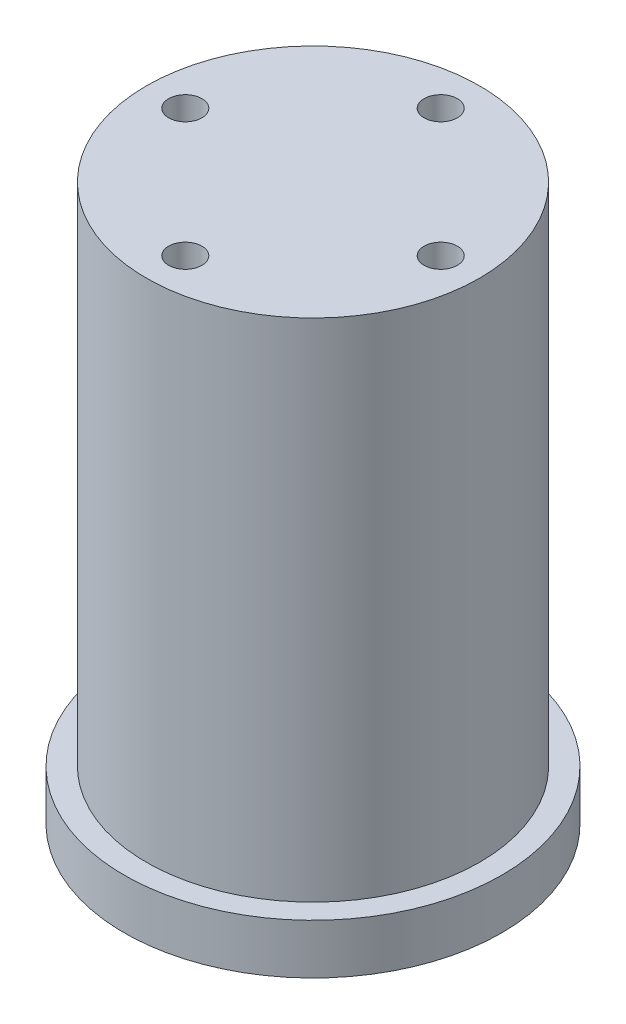
ISO-10303-21;
HEADER;
FILE_DESCRIPTION(('STEP AP214'),'2;1');
FILE_NAME('part.step','',(''),(''),'','','');
FILE_SCHEMA(('AUTOMOTIVE_DESIGN { 1 0 10303 214 1 1 1 1 }'));
ENDSEC;
DATA;
#1=APPLICATION_CONTEXT('core data for automotive mechanical design processes');
#2=APPLICATION_PROTOCOL_DEFINITION('international standard','automotive_design',2000,#1);
#3=PRODUCT_CONTEXT('',#1,'mechanical');
#4=PRODUCT('Part','Part','',(#3));
#5=PRODUCT_RELATED_PRODUCT_CATEGORY('part','',(#4));
#6=PRODUCT_DEFINITION_FORMATION('','',#4);
#7=PRODUCT_DEFINITION_CONTEXT('part definition',#1,'design');
#8=PRODUCT_DEFINITION('design','',#6,#7);
#9=PRODUCT_DEFINITION_SHAPE('','',#8);
#10=(LENGTH_UNIT() NAMED_UNIT(*) SI_UNIT(.MILLI.,.METRE.));
#11=(NAMED_UNIT(*) PLANE_ANGLE_UNIT() SI_UNIT($,.RADIAN.));
#12=(NAMED_UNIT(*) SI_UNIT($,.STERADIAN.) SOLID_ANGLE_UNIT());
#13=UNCERTAINTY_MEASURE_WITH_UNIT(LENGTH_MEASURE(1.E-05),#10,'distance_accuracy_value','');
#14=(GEOMETRIC_REPRESENTATION_CONTEXT(3) GLOBAL_UNCERTAINTY_ASSIGNED_CONTEXT((#13)) GLOBAL_UNIT_ASSIGNED_CONTEXT((#10,
#11,#12)) REPRESENTATION_CONTEXT('',''));
#15=CARTESIAN_POINT('',(0.,0.,0.));
#16=DIRECTION('',(0.,0.,1.));
#17=DIRECTION('',(1.,0.,0.));
#18=AXIS2_PLACEMENT_3D('',#15,#16,#17);
#19=CARTESIAN_POINT('',(0.,0.,0.));
#20=DIRECTION('',(0.,1.,0.));
#21=DIRECTION('',(1.,0.,0.));
#22=AXIS2_PLACEMENT_3D('',#19,#20,#21);
#23=PLANE('',#22);
#24=CARTESIAN_POINT('',(15.5,0.,26.8467875173176));
#25=DIRECTION('',(0.,-1.,0.));
#26=DIRECTION('',(1.,0.,0.));
#27=AXIS2_PLACEMENT_3D('',#24,#25,#26);
#28=CIRCLE('',#27,2.);
#29=CARTESIAN_POINT('',(13.5,0.,26.8467875173176));
#30=VERTEX_POINT('',#29);
#31=EDGE_CURVE('E183',#30,#30,#28,.T.);
#32=ORIENTED_EDGE('',*,*,#31,.F.);
#33=EDGE_LOOP('',(#32));
#34=FACE_BOUND('',#33,.T.);
#35=CARTESIAN_POINT('',(21.920310216783,0.,-21.920310216783));
#36=DIRECTION('',(0.,-1.,0.));
#37=DIRECTION('',(1.,0.,0.));
#38=AXIS2_PLACEMENT_3D('',#35,#36,#37);
#39=CIRCLE('',#38,2.);
#40=CARTESIAN_POINT('',(19.920310216783,0.,-21.920310216783));
#41=VERTEX_POINT('',#40);
#42=EDGE_CURVE('E174',#41,#41,#39,.T.);
#43=ORIENTED_EDGE('',*,*,#42,.F.);
#44=EDGE_LOOP('',(#43));
#45=FACE_BOUND('',#44,.T.);
#46=CARTESIAN_POINT('',(-15.5,0.,26.8467875173176));
#47=DIRECTION('',(0.,-1.,0.));
#48=DIRECTION('',(1.,0.,0.));
#49=AXIS2_PLACEMENT_3D('',#46,#47,#48);
#50=CIRCLE('',#49,2.);
#51=CARTESIAN_POINT('',(-17.5,0.,26.8467875173176));
#52=VERTEX_POINT('',#51);
#53=EDGE_CURVE('E173',#52,#52,#50,.T.);
#54=ORIENTED_EDGE('',*,*,#53,.F.);
#55=EDGE_LOOP('',(#54));
#56=FACE_BOUND('',#55,.T.);
#57=CARTESIAN_POINT('',(-21.920310216783,0.,-21.920310216783));
#58=DIRECTION('',(0.,-1.,0.));
#59=DIRECTION('',(1.,0.,0.));
#60=AXIS2_PLACEMENT_3D('',#57,#58,#59);
#61=CIRCLE('',#60,2.);
#62=CARTESIAN_POINT('',(-23.920310216783,0.,-21.920310216783));
#63=VERTEX_POINT('',#62);
#64=EDGE_CURVE('E216',#63,#63,#61,.T.);
#65=ORIENTED_EDGE('',*,*,#64,.F.);
#66=EDGE_LOOP('',(#65));
#67=FACE_BOUND('',#66,.T.);
#68=CARTESIAN_POINT('',(-31.,0.,0.));
#69=DIRECTION('',(0.,-1.,0.));
#70=DIRECTION('',(1.,0.,0.));
#71=AXIS2_PLACEMENT_3D('',#68,#69,#70);
#72=CIRCLE('',#71,2.);
#73=CARTESIAN_POINT('',(-33.,0.,0.));
#74=VERTEX_POINT('',#73);
#75=EDGE_CURVE('E207',#74,#74,#72,.T.);
#76=ORIENTED_EDGE('',*,*,#75,.F.);
#77=EDGE_LOOP('',(#76));
#78=FACE_BOUND('',#77,.T.);
#79=CARTESIAN_POINT('',(0.,0.,0.));
#80=DIRECTION('',(0.,-1.,0.));
#81=DIRECTION('',(1.,0.,0.));
#82=AXIS2_PLACEMENT_3D('',#79,#80,#81);
#83=CIRCLE('',#82,28.);
#84=CARTESIAN_POINT('',(-28.,0.,0.));
#85=VERTEX_POINT('',#84);
#86=EDGE_CURVE('E234',#85,#85,#83,.T.);
#87=ORIENTED_EDGE('',*,*,#86,.F.);
#88=EDGE_LOOP('',(#87));
#89=FACE_BOUND('',#88,.T.);
#90=CARTESIAN_POINT('',(31.,0.,0.));
#91=DIRECTION('',(0.,-1.,0.));
#92=DIRECTION('',(1.,0.,0.));
#93=AXIS2_PLACEMENT_3D('',#90,#91,#92);
#94=CIRCLE('',#93,2.);
#95=CARTESIAN_POINT('',(29.,0.,0.));
#96=VERTEX_POINT('',#95);
#97=EDGE_CURVE('E236',#96,#96,#94,.T.);
#98=ORIENTED_EDGE('',*,*,#97,.F.);
#99=EDGE_LOOP('',(#98));
#100=FACE_BOUND('',#99,.T.);
#101=CARTESIAN_POINT('',(0.,0.,0.));
#102=DIRECTION('',(0.,1.,0.));
#103=DIRECTION('',(-1.,0.,0.));
#104=AXIS2_PLACEMENT_3D('',#101,#102,#103);
#105=CIRCLE('',#104,34.);
#106=CARTESIAN_POINT('',(34.,0.,0.));
#107=VERTEX_POINT('',#106);
#108=EDGE_CURVE('E11',#107,#107,#105,.T.);
#109=ORIENTED_EDGE('',*,*,#108,.F.);
#110=EDGE_LOOP('',(#109));
#111=FACE_BOUND('',#110,.T.);
#112=ADVANCED_FACE('F17',(#34,#45,#56,#67,#78,#89,#100,#111),#23,.F.);
#113=CARTESIAN_POINT('',(0.,0.,0.));
#114=DIRECTION('',(0.,1.,0.));
#115=DIRECTION('',(-1.,0.,0.));
#116=AXIS2_PLACEMENT_3D('',#113,#114,#115);
#117=CYLINDRICAL_SURFACE('',#116,34.);
#118=CARTESIAN_POINT('',(0.,9.,0.));
#119=DIRECTION('',(0.,1.,0.));
#120=DIRECTION('',(1.,0.,0.));
#121=AXIS2_PLACEMENT_3D('',#118,#119,#120);
#122=CIRCLE('',#121,34.);
#123=CARTESIAN_POINT('',(34.,9.,0.));
#124=VERTEX_POINT('',#123);
#125=EDGE_CURVE('E222',#124,#124,#122,.T.);
#126=ORIENTED_EDGE('',*,*,#125,.F.);
#127=DIRECTION('',(0.,-1.,0.));
#128=VECTOR('',#127,1.);
#129=CARTESIAN_POINT('',(34.,0.,0.));
#130=LINE('',#129,#128);
#131=EDGE_CURVE('E28',#124,#107,#130,.T.);
#132=ORIENTED_EDGE('',*,*,#131,.T.);
#133=ORIENTED_EDGE('',*,*,#108,.T.);
#134=ORIENTED_EDGE('',*,*,#131,.F.);
#135=EDGE_LOOP('',(#126,#132,#133,#134));
#136=FACE_BOUND('',#135,.T.);
#137=ADVANCED_FACE('F255',(#136),#117,.T.);
#138=CARTESIAN_POINT('',(31.,0.,0.));
#139=DIRECTION('',(0.,1.,0.));
#140=DIRECTION('',(1.,0.,0.));
#141=AXIS2_PLACEMENT_3D('',#138,#139,#140);
#142=CYLINDRICAL_SURFACE('',#141,2.);
#143=CARTESIAN_POINT('',(31.,7.,0.));
#144=DIRECTION('',(0.,-1.,0.));
#145=DIRECTION('',(1.,0.,0.));
#146=AXIS2_PLACEMENT_3D('',#143,#144,#145);
#147=CIRCLE('',#146,2.);
#148=CARTESIAN_POINT('',(29.,7.,0.));
#149=VERTEX_POINT('',#148);
#150=EDGE_CURVE('E332',#149,#149,#147,.T.);
#151=ORIENTED_EDGE('',*,*,#150,.F.);
#152=DIRECTION('',(0.,-1.,0.));
#153=VECTOR('',#152,1.);
#154=CARTESIAN_POINT('',(29.,0.,0.));
#155=LINE('',#154,#153);
#156=EDGE_CURVE('E21',#149,#96,#155,.T.);
#157=ORIENTED_EDGE('',*,*,#156,.T.);
#158=ORIENTED_EDGE('',*,*,#97,.T.);
#159=ORIENTED_EDGE('',*,*,#156,.F.);
#160=EDGE_LOOP('',(#151,#157,#158,#159));
#161=FACE_BOUND('',#160,.T.);
#162=ADVANCED_FACE('F280',(#161),#142,.F.);
#163=CARTESIAN_POINT('',(0.,0.,0.));
#164=DIRECTION('',(0.,1.,0.));
#165=DIRECTION('',(1.,0.,0.));
#166=AXIS2_PLACEMENT_3D('',#163,#164,#165);
#167=CYLINDRICAL_SURFACE('',#166,28.);
#168=CARTESIAN_POINT('',(0.,80.1,0.));
#169=DIRECTION('',(0.,-1.,0.));
#170=DIRECTION('',(-1.,0.,0.));
#171=AXIS2_PLACEMENT_3D('',#168,#169,#170);
#172=CIRCLE('',#171,28.);
#173=CARTESIAN_POINT('',(-28.,80.1,0.));
#174=VERTEX_POINT('',#173);
#175=EDGE_CURVE('E162',#174,#174,#172,.T.);
#176=ORIENTED_EDGE('',*,*,#175,.F.);
#177=DIRECTION('',(0.,-1.,0.));
#178=VECTOR('',#177,1.);
#179=CARTESIAN_POINT('',(-28.,0.,0.));
#180=LINE('',#179,#178);
#181=EDGE_CURVE('E210',#174,#85,#180,.T.);
#182=ORIENTED_EDGE('',*,*,#181,.T.);
#183=ORIENTED_EDGE('',*,*,#86,.T.);
#184=ORIENTED_EDGE('',*,*,#181,.F.);
#185=EDGE_LOOP('',(#176,#182,#183,#184));
#186=FACE_BOUND('',#185,.T.);
#187=ADVANCED_FACE('F309',(#186),#167,.F.);
#188=CARTESIAN_POINT('',(-31.,0.,0.));
#189=DIRECTION('',(0.,1.,0.));
#190=DIRECTION('',(1.,0.,0.));
#191=AXIS2_PLACEMENT_3D('',#188,#189,#190);
#192=CYLINDRICAL_SURFACE('',#191,2.);
#193=CARTESIAN_POINT('',(-31.,7.,0.));
#194=DIRECTION('',(0.,-1.,0.));
#195=DIRECTION('',(1.,0.,0.));
#196=AXIS2_PLACEMENT_3D('',#193,#194,#195);
#197=CIRCLE('',#196,2.);
#198=CARTESIAN_POINT('',(-33.,7.,0.));
#199=VERTEX_POINT('',#198);
#200=EDGE_CURVE('E204',#199,#199,#197,.T.);
#201=ORIENTED_EDGE('',*,*,#200,.F.);
#202=DIRECTION('',(0.,-1.,0.));
#203=VECTOR('',#202,1.);
#204=CARTESIAN_POINT('',(-33.,0.,0.));
#205=LINE('',#204,#203);
#206=EDGE_CURVE('E211',#199,#74,#205,.T.);
#207=ORIENTED_EDGE('',*,*,#206,.T.);
#208=ORIENTED_EDGE('',*,*,#75,.T.);
#209=ORIENTED_EDGE('',*,*,#206,.F.);
#210=EDGE_LOOP('',(#201,#207,#208,#209));
#211=FACE_BOUND('',#210,.T.);
#212=ADVANCED_FACE('F306',(#211),#192,.F.);
#213=CARTESIAN_POINT('',(-21.920310216783,0.,-21.920310216783));
#214=DIRECTION('',(0.,1.,0.));
#215=DIRECTION('',(1.,0.,0.));
#216=AXIS2_PLACEMENT_3D('',#213,#214,#215);
#217=CYLINDRICAL_SURFACE('',#216,2.);
#218=CARTESIAN_POINT('',(-21.920310216783,7.,-21.920310216783));
#219=DIRECTION('',(0.,-1.,0.));
#220=DIRECTION('',(1.,0.,0.));
#221=AXIS2_PLACEMENT_3D('',#218,#219,#220);
#222=CIRCLE('',#221,2.);
#223=CARTESIAN_POINT('',(-23.920310216783,7.,-21.920310216783));
#224=VERTEX_POINT('',#223);
#225=EDGE_CURVE('E179',#224,#224,#222,.T.);
#226=ORIENTED_EDGE('',*,*,#225,.F.);
#227=DIRECTION('',(0.,-1.,0.));
#228=VECTOR('',#227,1.);
#229=CARTESIAN_POINT('',(-23.920310216783,0.,-21.920310216783));
#230=LINE('',#229,#228);
#231=EDGE_CURVE('E212',#224,#63,#230,.T.);
#232=ORIENTED_EDGE('',*,*,#231,.T.);
#233=ORIENTED_EDGE('',*,*,#64,.T.);
#234=ORIENTED_EDGE('',*,*,#231,.F.);
#235=EDGE_LOOP('',(#226,#232,#233,#234));
#236=FACE_BOUND('',#235,.T.);
#237=ADVANCED_FACE('F302',(#236),#217,.F.);
#238=CARTESIAN_POINT('',(-15.5,0.,26.8467875173176));
#239=DIRECTION('',(0.,1.,0.));
#240=DIRECTION('',(1.,0.,0.));
#241=AXIS2_PLACEMENT_3D('',#238,#239,#240);
#242=CYLINDRICAL_SURFACE('',#241,2.);
#243=CARTESIAN_POINT('',(-15.5,7.,26.8467875173176));
#244=DIRECTION('',(0.,-1.,0.));
#245=DIRECTION('',(1.,0.,0.));
#246=AXIS2_PLACEMENT_3D('',#243,#244,#245);
#247=CIRCLE('',#246,2.);
#248=CARTESIAN_POINT('',(-17.5,7.,26.8467875173176));
#249=VERTEX_POINT('',#248);
#250=EDGE_CURVE('E323',#249,#249,#247,.T.);
#251=ORIENTED_EDGE('',*,*,#250,.F.);
#252=DIRECTION('',(0.,-1.,0.));
#253=VECTOR('',#252,1.);
#254=CARTESIAN_POINT('',(-17.5,0.,26.8467875173176));
#255=LINE('',#254,#253);
#256=EDGE_CURVE('E170',#249,#52,#255,.T.);
#257=ORIENTED_EDGE('',*,*,#256,.T.);
#258=ORIENTED_EDGE('',*,*,#53,.T.);
#259=ORIENTED_EDGE('',*,*,#256,.F.);
#260=EDGE_LOOP('',(#251,#257,#258,#259));
#261=FACE_BOUND('',#260,.T.);
#262=ADVANCED_FACE('F299',(#261),#242,.F.);
#263=CARTESIAN_POINT('',(21.920310216783,0.,-21.920310216783));
#264=DIRECTION('',(0.,1.,0.));
#265=DIRECTION('',(1.,0.,0.));
#266=AXIS2_PLACEMENT_3D('',#263,#264,#265);
#267=CYLINDRICAL_SURFACE('',#266,2.);
#268=CARTESIAN_POINT('',(21.920310216783,7.,-21.920310216783));
#269=DIRECTION('',(0.,-1.,0.));
#270=DIRECTION('',(1.,0.,0.));
#271=AXIS2_PLACEMENT_3D('',#268,#269,#270);
#272=CIRCLE('',#271,2.);
#273=CARTESIAN_POINT('',(19.920310216783,7.,-21.920310216783));
#274=VERTEX_POINT('',#273);
#275=EDGE_CURVE('E349',#274,#274,#272,.T.);
#276=ORIENTED_EDGE('',*,*,#275,.F.);
#277=DIRECTION('',(0.,-1.,0.));
#278=VECTOR('',#277,1.);
#279=CARTESIAN_POINT('',(19.920310216783,0.,-21.920310216783));
#280=LINE('',#279,#278);
#281=EDGE_CURVE('E180',#274,#41,#280,.T.);
#282=ORIENTED_EDGE('',*,*,#281,.T.);
#283=ORIENTED_EDGE('',*,*,#42,.T.);
#284=ORIENTED_EDGE('',*,*,#281,.F.);
#285=EDGE_LOOP('',(#276,#282,#283,#284));
#286=FACE_BOUND('',#285,.T.);
#287=ADVANCED_FACE('F19',(#286),#267,.F.);
#288=CARTESIAN_POINT('',(15.5,0.,26.8467875173176));
#289=DIRECTION('',(0.,1.,0.));
#290=DIRECTION('',(1.,0.,0.));
#291=AXIS2_PLACEMENT_3D('',#288,#289,#290);
#292=CYLINDRICAL_SURFACE('',#291,2.);
#293=CARTESIAN_POINT('',(15.5,7.,26.8467875173176));
#294=DIRECTION('',(0.,-1.,0.));
#295=DIRECTION('',(1.,0.,0.));
#296=AXIS2_PLACEMENT_3D('',#293,#294,#295);
#297=CIRCLE('',#296,2.);
#298=CARTESIAN_POINT('',(13.5,7.,26.8467875173176));
#299=VERTEX_POINT('',#298);
#300=EDGE_CURVE('E325',#299,#299,#297,.T.);
#301=ORIENTED_EDGE('',*,*,#300,.F.);
#302=DIRECTION('',(0.,-1.,0.));
#303=VECTOR('',#302,1.);
#304=CARTESIAN_POINT('',(13.5,0.,26.8467875173176));
#305=LINE('',#304,#303);
#306=EDGE_CURVE('E223',#299,#30,#305,.T.);
#307=ORIENTED_EDGE('',*,*,#306,.T.);
#308=ORIENTED_EDGE('',*,*,#31,.T.);
#309=ORIENTED_EDGE('',*,*,#306,.F.);
#310=EDGE_LOOP('',(#301,#307,#308,#309));
#311=FACE_BOUND('',#310,.T.);
#312=ADVANCED_FACE('F286',(#311),#292,.F.);
#313=CARTESIAN_POINT('',(0.,7.,0.));
#314=DIRECTION('',(0.,1.,0.));
#315=DIRECTION('',(1.,0.,0.));
#316=AXIS2_PLACEMENT_3D('',#313,#314,#315);
#317=CYLINDRICAL_SURFACE('',#316,30.);
#318=CARTESIAN_POINT('',(0.,100.1,0.));
#319=DIRECTION('',(0.,1.,0.));
#320=DIRECTION('',(1.,0.,0.));
#321=AXIS2_PLACEMENT_3D('',#318,#319,#320);
#322=CIRCLE('',#321,30.);
#323=CARTESIAN_POINT('',(-30.,100.1,0.));
#324=VERTEX_POINT('',#323);
#325=EDGE_CURVE('E153',#324,#324,#322,.T.);
#326=ORIENTED_EDGE('',*,*,#325,.F.);
#327=DIRECTION('',(0.,-1.,0.));
#328=VECTOR('',#327,1.);
#329=CARTESIAN_POINT('',(-30.,7.,0.));
#330=LINE('',#329,#328);
#331=CARTESIAN_POINT('',(-30.,9.,0.));
#332=VERTEX_POINT('',#331);
#333=EDGE_CURVE('E168',#324,#332,#330,.T.);
#334=ORIENTED_EDGE('',*,*,#333,.T.);
#335=CARTESIAN_POINT('',(0.,9.,0.));
#336=DIRECTION('',(0.,1.,0.));
#337=DIRECTION('',(1.,0.,0.));
#338=AXIS2_PLACEMENT_3D('',#335,#336,#337);
#339=CIRCLE('',#338,30.);
#340=EDGE_CURVE('E217',#332,#332,#339,.T.);
#341=ORIENTED_EDGE('',*,*,#340,.T.);
#342=ORIENTED_EDGE('',*,*,#333,.F.);
#343=EDGE_LOOP('',(#326,#334,#341,#342));
#344=FACE_BOUND('',#343,.T.);
#345=ADVANCED_FACE('F517',(#344),#317,.T.);
#346=CARTESIAN_POINT('',(0.,7.,0.));
#347=DIRECTION('',(0.,1.,0.));
#348=DIRECTION('',(1.,0.,0.));
#349=AXIS2_PLACEMENT_3D('',#346,#347,#348);
#350=PLANE('',#349);
#351=ORIENTED_EDGE('',*,*,#275,.T.);
#352=EDGE_LOOP('',(#351));
#353=FACE_BOUND('',#352,.T.);
#354=ADVANCED_FACE('F515',(#353),#350,.F.);
#355=CARTESIAN_POINT('',(0.,7.,0.));
#356=DIRECTION('',(0.,1.,0.));
#357=DIRECTION('',(1.,0.,0.));
#358=AXIS2_PLACEMENT_3D('',#355,#356,#357);
#359=PLANE('',#358);
#360=ORIENTED_EDGE('',*,*,#150,.T.);
#361=EDGE_LOOP('',(#360));
#362=FACE_BOUND('',#361,.T.);
#363=ADVANCED_FACE('F318',(#362),#359,.F.);
#364=CARTESIAN_POINT('',(0.,7.,0.));
#365=DIRECTION('',(0.,1.,0.));
#366=DIRECTION('',(1.,0.,0.));
#367=AXIS2_PLACEMENT_3D('',#364,#365,#366);
#368=PLANE('',#367);
#369=ORIENTED_EDGE('',*,*,#300,.T.);
#370=EDGE_LOOP('',(#369));
#371=FACE_BOUND('',#370,.T.);
#372=ADVANCED_FACE('F312',(#371),#368,.F.);
#373=CARTESIAN_POINT('',(0.,7.,0.));
#374=DIRECTION('',(0.,1.,0.));
#375=DIRECTION('',(1.,0.,0.));
#376=AXIS2_PLACEMENT_3D('',#373,#374,#375);
#377=PLANE('',#376);
#378=ORIENTED_EDGE('',*,*,#250,.T.);
#379=EDGE_LOOP('',(#378));
#380=FACE_BOUND('',#379,.T.);
#381=ADVANCED_FACE('F297',(#380),#377,.F.);
#382=CARTESIAN_POINT('',(0.,7.,0.));
#383=DIRECTION('',(0.,1.,0.));
#384=DIRECTION('',(1.,0.,0.));
#385=AXIS2_PLACEMENT_3D('',#382,#383,#384);
#386=PLANE('',#385);
#387=ORIENTED_EDGE('',*,*,#200,.T.);
#388=EDGE_LOOP('',(#387));
#389=FACE_BOUND('',#388,.T.);
#390=ADVANCED_FACE('F293',(#389),#386,.F.);
#391=CARTESIAN_POINT('',(0.,7.,0.));
#392=DIRECTION('',(0.,1.,0.));
#393=DIRECTION('',(1.,0.,0.));
#394=AXIS2_PLACEMENT_3D('',#391,#392,#393);
#395=PLANE('',#394);
#396=ORIENTED_EDGE('',*,*,#225,.T.);
#397=EDGE_LOOP('',(#396));
#398=FACE_BOUND('',#397,.T.);
#399=ADVANCED_FACE('F296',(#398),#395,.F.);
#400=CARTESIAN_POINT('',(0.,80.1,0.));
#401=DIRECTION('',(0.,1.,0.));
#402=DIRECTION('',(1.,0.,0.));
#403=AXIS2_PLACEMENT_3D('',#400,#401,#402);
#404=PLANE('',#403);
#405=CARTESIAN_POINT('',(0.,80.1,23.));
#406=DIRECTION('',(0.,1.,0.));
#407=DIRECTION('',(1.,0.,0.));
#408=AXIS2_PLACEMENT_3D('',#405,#406,#407);
#409=CIRCLE('',#408,3.);
#410=CARTESIAN_POINT('',(-3.,80.1,23.));
#411=VERTEX_POINT('',#410);
#412=EDGE_CURVE('E147',#411,#411,#409,.T.);
#413=ORIENTED_EDGE('',*,*,#412,.T.);
#414=EDGE_LOOP('',(#413));
#415=FACE_BOUND('',#414,.T.);
#416=CARTESIAN_POINT('',(23.,80.1,0.));
#417=DIRECTION('',(0.,1.,0.));
#418=DIRECTION('',(1.,0.,0.));
#419=AXIS2_PLACEMENT_3D('',#416,#417,#418);
#420=CIRCLE('',#419,3.);
#421=CARTESIAN_POINT('',(20.,80.1,0.));
#422=VERTEX_POINT('',#421);
#423=EDGE_CURVE('E195',#422,#422,#420,.T.);
#424=ORIENTED_EDGE('',*,*,#423,.T.);
#425=EDGE_LOOP('',(#424));
#426=FACE_BOUND('',#425,.T.);
#427=CARTESIAN_POINT('',(-23.,80.1,0.));
#428=DIRECTION('',(0.,1.,0.));
#429=DIRECTION('',(1.,0.,0.));
#430=AXIS2_PLACEMENT_3D('',#427,#428,#429);
#431=CIRCLE('',#430,3.);
#432=CARTESIAN_POINT('',(-26.,80.1,0.));
#433=VERTEX_POINT('',#432);
#434=EDGE_CURVE('E68',#433,#433,#431,.T.);
#435=ORIENTED_EDGE('',*,*,#434,.T.);
#436=EDGE_LOOP('',(#435));
#437=FACE_BOUND('',#436,.T.);
#438=CARTESIAN_POINT('',(0.,80.1,-23.));
#439=DIRECTION('',(0.,1.,0.));
#440=DIRECTION('',(1.,0.,0.));
#441=AXIS2_PLACEMENT_3D('',#438,#439,#440);
#442=CIRCLE('',#441,3.);
#443=CARTESIAN_POINT('',(-3.,80.1,-23.));
#444=VERTEX_POINT('',#443);
#445=EDGE_CURVE('E246',#444,#444,#442,.T.);
#446=ORIENTED_EDGE('',*,*,#445,.T.);
#447=EDGE_LOOP('',(#446));
#448=FACE_BOUND('',#447,.T.);
#449=ORIENTED_EDGE('',*,*,#175,.T.);
#450=EDGE_LOOP('',(#449));
#451=FACE_BOUND('',#450,.T.);
#452=ADVANCED_FACE('F148',(#415,#426,#437,#448,#451),#404,.F.);
#453=CARTESIAN_POINT('',(0.,100.1,0.));
#454=DIRECTION('',(0.,1.,0.));
#455=DIRECTION('',(1.,0.,0.));
#456=AXIS2_PLACEMENT_3D('',#453,#454,#455);
#457=PLANE('',#456);
#458=CARTESIAN_POINT('',(0.,100.1,23.));
#459=DIRECTION('',(0.,-1.,0.));
#460=DIRECTION('',(1.,0.,0.));
#461=AXIS2_PLACEMENT_3D('',#458,#459,#460);
#462=CIRCLE('',#461,3.);
#463=CARTESIAN_POINT('',(-3.,100.1,23.));
#464=VERTEX_POINT('',#463);
#465=EDGE_CURVE('E164',#464,#464,#462,.T.);
#466=ORIENTED_EDGE('',*,*,#465,.T.);
#467=EDGE_LOOP('',(#466));
#468=FACE_BOUND('',#467,.T.);
#469=CARTESIAN_POINT('',(23.,100.1,0.));
#470=DIRECTION('',(0.,-1.,0.));
#471=DIRECTION('',(1.,0.,0.));
#472=AXIS2_PLACEMENT_3D('',#469,#470,#471);
#473=CIRCLE('',#472,3.);
#474=CARTESIAN_POINT('',(20.,100.1,0.));
#475=VERTEX_POINT('',#474);
#476=EDGE_CURVE('E184',#475,#475,#473,.T.);
#477=ORIENTED_EDGE('',*,*,#476,.T.);
#478=EDGE_LOOP('',(#477));
#479=FACE_BOUND('',#478,.T.);
#480=CARTESIAN_POINT('',(-23.,100.1,0.));
#481=DIRECTION('',(0.,-1.,0.));
#482=DIRECTION('',(1.,0.,0.));
#483=AXIS2_PLACEMENT_3D('',#480,#481,#482);
#484=CIRCLE('',#483,3.);
#485=CARTESIAN_POINT('',(-26.,100.1,0.));
#486=VERTEX_POINT('',#485);
#487=EDGE_CURVE('E201',#486,#486,#484,.T.);
#488=ORIENTED_EDGE('',*,*,#487,.T.);
#489=EDGE_LOOP('',(#488));
#490=FACE_BOUND('',#489,.T.);
#491=CARTESIAN_POINT('',(0.,100.1,-23.));
#492=DIRECTION('',(0.,-1.,0.));
#493=DIRECTION('',(1.,0.,0.));
#494=AXIS2_PLACEMENT_3D('',#491,#492,#493);
#495=CIRCLE('',#494,3.);
#496=CARTESIAN_POINT('',(-3.,100.1,-23.));
#497=VERTEX_POINT('',#496);
#498=EDGE_CURVE('E221',#497,#497,#495,.T.);
#499=ORIENTED_EDGE('',*,*,#498,.T.);
#500=EDGE_LOOP('',(#499));
#501=FACE_BOUND('',#500,.T.);
#502=ORIENTED_EDGE('',*,*,#325,.T.);
#503=EDGE_LOOP('',(#502));
#504=FACE_BOUND('',#503,.T.);
#505=ADVANCED_FACE('F292',(#468,#479,#490,#501,#504),#457,.T.);
#506=CARTESIAN_POINT('',(0.,100.1,23.));
#507=DIRECTION('',(0.,-1.,0.));
#508=DIRECTION('',(1.,0.,0.));
#509=AXIS2_PLACEMENT_3D('',#506,#507,#508);
#510=CYLINDRICAL_SURFACE('',#509,3.);
#511=ORIENTED_EDGE('',*,*,#465,.F.);
#512=DIRECTION('',(0.,-1.,0.));
#513=VECTOR('',#512,1.);
#514=CARTESIAN_POINT('',(-3.,100.1,23.));
#515=LINE('',#514,#513);
#516=EDGE_CURVE('E154',#464,#411,#515,.T.);
#517=ORIENTED_EDGE('',*,*,#516,.T.);
#518=ORIENTED_EDGE('',*,*,#412,.F.);
#519=ORIENTED_EDGE('',*,*,#516,.F.);
#520=EDGE_LOOP('',(#511,#517,#518,#519));
#521=FACE_BOUND('',#520,.T.);
#522=ADVANCED_FACE('F288',(#521),#510,.F.);
#523=CARTESIAN_POINT('',(23.,100.1,0.));
#524=DIRECTION('',(0.,-1.,0.));
#525=DIRECTION('',(1.,0.,0.));
#526=AXIS2_PLACEMENT_3D('',#523,#524,#525);
#527=CYLINDRICAL_SURFACE('',#526,3.);
#528=ORIENTED_EDGE('',*,*,#476,.F.);
#529=DIRECTION('',(0.,-1.,0.));
#530=VECTOR('',#529,1.);
#531=CARTESIAN_POINT('',(20.,100.1,0.));
#532=LINE('',#531,#530);
#533=EDGE_CURVE('E187',#475,#422,#532,.T.);
#534=ORIENTED_EDGE('',*,*,#533,.T.);
#535=ORIENTED_EDGE('',*,*,#423,.F.);
#536=ORIENTED_EDGE('',*,*,#533,.F.);
#537=EDGE_LOOP('',(#528,#534,#535,#536));
#538=FACE_BOUND('',#537,.T.);
#539=ADVANCED_FACE('F291',(#538),#527,.F.);
#540=CARTESIAN_POINT('',(-23.,100.1,0.));
#541=DIRECTION('',(0.,-1.,0.));
#542=DIRECTION('',(1.,0.,0.));
#543=AXIS2_PLACEMENT_3D('',#540,#541,#542);
#544=CYLINDRICAL_SURFACE('',#543,3.);
#545=ORIENTED_EDGE('',*,*,#487,.F.);
#546=DIRECTION('',(0.,-1.,0.));
#547=VECTOR('',#546,1.);
#548=CARTESIAN_POINT('',(-26.,100.1,0.));
#549=LINE('',#548,#547);
#550=EDGE_CURVE('E79',#486,#433,#549,.T.);
#551=ORIENTED_EDGE('',*,*,#550,.T.);
#552=ORIENTED_EDGE('',*,*,#434,.F.);
#553=ORIENTED_EDGE('',*,*,#550,.F.);
#554=EDGE_LOOP('',(#545,#551,#552,#553));
#555=FACE_BOUND('',#554,.T.);
#556=ADVANCED_FACE('F267',(#555),#544,.F.);
#557=CARTESIAN_POINT('',(0.,100.1,-23.));
#558=DIRECTION('',(0.,-1.,0.));
#559=DIRECTION('',(1.,0.,0.));
#560=AXIS2_PLACEMENT_3D('',#557,#558,#559);
#561=CYLINDRICAL_SURFACE('',#560,3.);
#562=ORIENTED_EDGE('',*,*,#498,.F.);
#563=DIRECTION('',(0.,-1.,0.));
#564=VECTOR('',#563,1.);
#565=CARTESIAN_POINT('',(-3.,100.1,-23.));
#566=LINE('',#565,#564);
#567=EDGE_CURVE('E242',#497,#444,#566,.T.);
#568=ORIENTED_EDGE('',*,*,#567,.T.);
#569=ORIENTED_EDGE('',*,*,#445,.F.);
#570=ORIENTED_EDGE('',*,*,#567,.F.);
#571=EDGE_LOOP('',(#562,#568,#569,#570));
#572=FACE_BOUND('',#571,.T.);
#573=ADVANCED_FACE('F259',(#572),#561,.F.);
#574=CARTESIAN_POINT('',(0.,9.,0.));
#575=DIRECTION('',(0.,1.,0.));
#576=DIRECTION('',(1.,0.,0.));
#577=AXIS2_PLACEMENT_3D('',#574,#575,#576);
#578=PLANE('',#577);
#579=ORIENTED_EDGE('',*,*,#340,.F.);
#580=EDGE_LOOP('',(#579));
#581=FACE_BOUND('',#580,.T.);
#582=ORIENTED_EDGE('',*,*,#125,.T.);
#583=EDGE_LOOP('',(#582));
#584=FACE_BOUND('',#583,.T.);
#585=ADVANCED_FACE('F257',(#581,#584),#578,.T.);
#586=CLOSED_SHELL('',(#112,#137,#162,#187,#212,#237,#262,#287,#312,#345,#354,#363,#372,#381,
#390,#399,#452,#505,#522,#539,#556,#573,#585));
#587=MANIFOLD_SOLID_BREP('B1',#586);
#588=ADVANCED_BREP_SHAPE_REPRESENTATION('',(#18,#587),#14);
#589=SHAPE_DEFINITION_REPRESENTATION(#9,#588);
ENDSEC;
END-ISO-10303-21;
